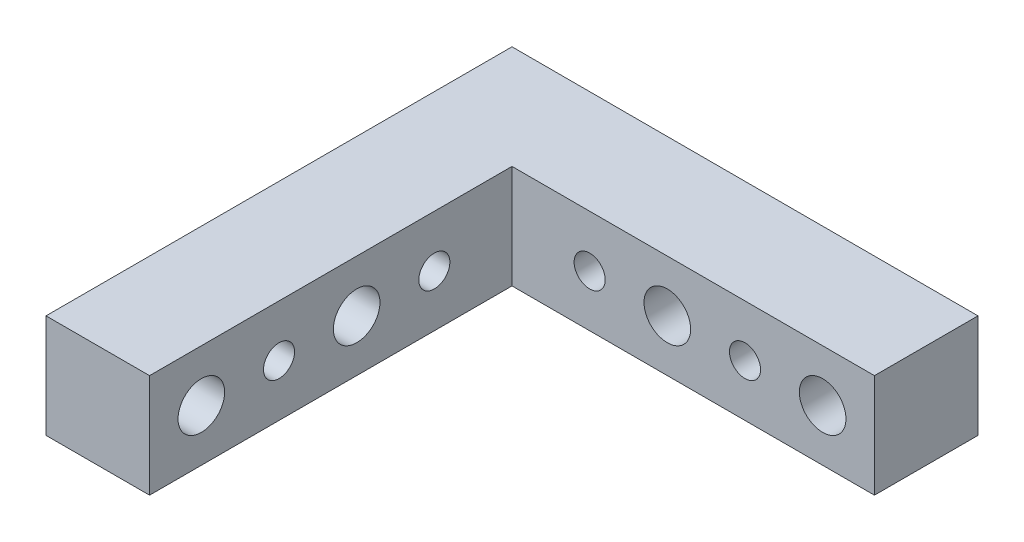
ISO-10303-21;
HEADER;
FILE_DESCRIPTION(('STEP AP214'),'2;1');
FILE_NAME('part.step','',(''),(''),'','','');
FILE_SCHEMA(('AUTOMOTIVE_DESIGN { 1 0 10303 214 1 1 1 1 }'));
ENDSEC;
DATA;
#1=APPLICATION_CONTEXT('core data for automotive mechanical design processes');
#2=APPLICATION_PROTOCOL_DEFINITION('international standard','automotive_design',2000,#1);
#3=PRODUCT_CONTEXT('',#1,'mechanical');
#4=PRODUCT('Part','Part','',(#3));
#5=PRODUCT_RELATED_PRODUCT_CATEGORY('part','',(#4));
#6=PRODUCT_DEFINITION_FORMATION('','',#4);
#7=PRODUCT_DEFINITION_CONTEXT('part definition',#1,'design');
#8=PRODUCT_DEFINITION('design','',#6,#7);
#9=PRODUCT_DEFINITION_SHAPE('','',#8);
#10=(LENGTH_UNIT() NAMED_UNIT(*) SI_UNIT(.MILLI.,.METRE.));
#11=(NAMED_UNIT(*) PLANE_ANGLE_UNIT() SI_UNIT($,.RADIAN.));
#12=(NAMED_UNIT(*) SI_UNIT($,.STERADIAN.) SOLID_ANGLE_UNIT());
#13=UNCERTAINTY_MEASURE_WITH_UNIT(LENGTH_MEASURE(1.E-05),#10,'distance_accuracy_value','');
#14=(GEOMETRIC_REPRESENTATION_CONTEXT(3) GLOBAL_UNCERTAINTY_ASSIGNED_CONTEXT((#13)) GLOBAL_UNIT_ASSIGNED_CONTEXT((#10,
#11,#12)) REPRESENTATION_CONTEXT('',''));
#15=CARTESIAN_POINT('',(0.,0.,0.));
#16=DIRECTION('',(0.,0.,1.));
#17=DIRECTION('',(1.,0.,0.));
#18=AXIS2_PLACEMENT_3D('',#15,#16,#17);
#19=CARTESIAN_POINT('',(90.,20.,0.));
#20=DIRECTION('',(0.,0.,1.));
#21=DIRECTION('',(1.,0.,0.));
#22=AXIS2_PLACEMENT_3D('',#19,#20,#21);
#23=PLANE('',#22);
#24=CARTESIAN_POINT('',(35.,10.,0.));
#25=DIRECTION('',(0.,0.,-1.));
#26=DIRECTION('',(-1.,0.,0.));
#27=AXIS2_PLACEMENT_3D('',#24,#25,#26);
#28=CIRCLE('',#27,3.);
#29=CARTESIAN_POINT('',(32.,10.,0.));
#30=VERTEX_POINT('',#29);
#31=EDGE_CURVE('E164',#30,#30,#28,.T.);
#32=ORIENTED_EDGE('',*,*,#31,.F.);
#33=EDGE_LOOP('',(#32));
#34=FACE_BOUND('',#33,.T.);
#35=CARTESIAN_POINT('',(50.,10.,0.));
#36=DIRECTION('',(0.,0.,-1.));
#37=DIRECTION('',(-1.,0.,0.));
#38=AXIS2_PLACEMENT_3D('',#35,#36,#37);
#39=CIRCLE('',#38,4.5);
#40=CARTESIAN_POINT('',(45.5,10.,0.));
#41=VERTEX_POINT('',#40);
#42=EDGE_CURVE('E168',#41,#41,#39,.T.);
#43=ORIENTED_EDGE('',*,*,#42,.F.);
#44=EDGE_LOOP('',(#43));
#45=FACE_BOUND('',#44,.T.);
#46=CARTESIAN_POINT('',(65.,10.,0.));
#47=DIRECTION('',(0.,0.,-1.));
#48=DIRECTION('',(-1.,0.,0.));
#49=AXIS2_PLACEMENT_3D('',#46,#47,#48);
#50=CIRCLE('',#49,3.);
#51=CARTESIAN_POINT('',(62.,10.,0.));
#52=VERTEX_POINT('',#51);
#53=EDGE_CURVE('E172',#52,#52,#50,.T.);
#54=ORIENTED_EDGE('',*,*,#53,.F.);
#55=EDGE_LOOP('',(#54));
#56=FACE_BOUND('',#55,.T.);
#57=CARTESIAN_POINT('',(80.,10.,0.));
#58=DIRECTION('',(0.,0.,-1.));
#59=DIRECTION('',(-1.,0.,0.));
#60=AXIS2_PLACEMENT_3D('',#57,#58,#59);
#61=CIRCLE('',#60,4.5);
#62=CARTESIAN_POINT('',(75.5,10.,0.));
#63=VERTEX_POINT('',#62);
#64=EDGE_CURVE('E175',#63,#63,#61,.T.);
#65=ORIENTED_EDGE('',*,*,#64,.F.);
#66=EDGE_LOOP('',(#65));
#67=FACE_BOUND('',#66,.T.);
#68=DIRECTION('',(-1.,0.,0.));
#69=VECTOR('',#68,1.);
#70=CARTESIAN_POINT('',(90.,0.,0.));
#71=LINE('',#70,#69);
#72=CARTESIAN_POINT('',(90.,0.,0.));
#73=VERTEX_POINT('',#72);
#74=CARTESIAN_POINT('',(0.,0.,0.));
#75=VERTEX_POINT('',#74);
#76=EDGE_CURVE('E119',#73,#75,#71,.T.);
#77=ORIENTED_EDGE('',*,*,#76,.T.);
#78=DIRECTION('',(0.,-1.,0.));
#79=VECTOR('',#78,1.);
#80=CARTESIAN_POINT('',(0.,20.,0.));
#81=LINE('',#80,#79);
#82=CARTESIAN_POINT('',(0.,20.,0.));
#83=VERTEX_POINT('',#82);
#84=EDGE_CURVE('E11',#83,#75,#81,.T.);
#85=ORIENTED_EDGE('',*,*,#84,.F.);
#86=DIRECTION('',(-1.,0.,0.));
#87=VECTOR('',#86,1.);
#88=CARTESIAN_POINT('',(90.,20.,0.));
#89=LINE('',#88,#87);
#90=CARTESIAN_POINT('',(90.,20.,0.));
#91=VERTEX_POINT('',#90);
#92=EDGE_CURVE('E130',#91,#83,#89,.T.);
#93=ORIENTED_EDGE('',*,*,#92,.F.);
#94=DIRECTION('',(0.,-1.,0.));
#95=VECTOR('',#94,1.);
#96=CARTESIAN_POINT('',(90.,20.,0.));
#97=LINE('',#96,#95);
#98=EDGE_CURVE('E115',#91,#73,#97,.T.);
#99=ORIENTED_EDGE('',*,*,#98,.T.);
#100=EDGE_LOOP('',(#77,#85,#93,#99));
#101=FACE_BOUND('',#100,.T.);
#102=ADVANCED_FACE('F35',(#34,#45,#56,#67,#101),#23,.F.);
#103=CARTESIAN_POINT('',(0.,20.,0.));
#104=DIRECTION('',(1.,0.,0.));
#105=DIRECTION('',(0.,0.,-1.));
#106=AXIS2_PLACEMENT_3D('',#103,#104,#105);
#107=PLANE('',#106);
#108=CARTESIAN_POINT('',(0.,10.,35.));
#109=DIRECTION('',(-1.,0.,0.));
#110=DIRECTION('',(0.,0.,1.));
#111=AXIS2_PLACEMENT_3D('',#108,#109,#110);
#112=CIRCLE('',#111,2.99999999999999);
#113=CARTESIAN_POINT('',(0.,10.,38.));
#114=VERTEX_POINT('',#113);
#115=EDGE_CURVE('E185',#114,#114,#112,.T.);
#116=ORIENTED_EDGE('',*,*,#115,.F.);
#117=EDGE_LOOP('',(#116));
#118=FACE_BOUND('',#117,.T.);
#119=CARTESIAN_POINT('',(0.,10.,50.));
#120=DIRECTION('',(-1.,0.,0.));
#121=DIRECTION('',(0.,0.,1.));
#122=AXIS2_PLACEMENT_3D('',#119,#120,#121);
#123=CIRCLE('',#122,4.5);
#124=CARTESIAN_POINT('',(0.,10.,54.5));
#125=VERTEX_POINT('',#124);
#126=EDGE_CURVE('E191',#125,#125,#123,.T.);
#127=ORIENTED_EDGE('',*,*,#126,.F.);
#128=EDGE_LOOP('',(#127));
#129=FACE_BOUND('',#128,.T.);
#130=CARTESIAN_POINT('',(0.,10.,65.));
#131=DIRECTION('',(-1.,0.,0.));
#132=DIRECTION('',(0.,0.,1.));
#133=AXIS2_PLACEMENT_3D('',#130,#131,#132);
#134=CIRCLE('',#133,3.00000000000001);
#135=CARTESIAN_POINT('',(0.,10.,68.));
#136=VERTEX_POINT('',#135);
#137=EDGE_CURVE('E197',#136,#136,#134,.T.);
#138=ORIENTED_EDGE('',*,*,#137,.F.);
#139=EDGE_LOOP('',(#138));
#140=FACE_BOUND('',#139,.T.);
#141=CARTESIAN_POINT('',(0.,10.,80.));
#142=DIRECTION('',(-1.,0.,0.));
#143=DIRECTION('',(0.,0.,1.));
#144=AXIS2_PLACEMENT_3D('',#141,#142,#143);
#145=CIRCLE('',#144,4.5);
#146=CARTESIAN_POINT('',(0.,10.,84.5));
#147=VERTEX_POINT('',#146);
#148=EDGE_CURVE('E203',#147,#147,#145,.T.);
#149=ORIENTED_EDGE('',*,*,#148,.F.);
#150=EDGE_LOOP('',(#149));
#151=FACE_BOUND('',#150,.T.);
#152=DIRECTION('',(0.,0.,1.));
#153=VECTOR('',#152,1.);
#154=CARTESIAN_POINT('',(0.,0.,0.));
#155=LINE('',#154,#153);
#156=CARTESIAN_POINT('',(0.,0.,90.));
#157=VERTEX_POINT('',#156);
#158=EDGE_CURVE('E122',#75,#157,#155,.T.);
#159=ORIENTED_EDGE('',*,*,#158,.T.);
#160=DIRECTION('',(0.,-1.,0.));
#161=VECTOR('',#160,1.);
#162=CARTESIAN_POINT('',(0.,20.,90.));
#163=LINE('',#162,#161);
#164=CARTESIAN_POINT('',(0.,20.,90.));
#165=VERTEX_POINT('',#164);
#166=EDGE_CURVE('E43',#165,#157,#163,.T.);
#167=ORIENTED_EDGE('',*,*,#166,.F.);
#168=DIRECTION('',(0.,0.,1.));
#169=VECTOR('',#168,1.);
#170=CARTESIAN_POINT('',(0.,20.,0.));
#171=LINE('',#170,#169);
#172=EDGE_CURVE('E88',#83,#165,#171,.T.);
#173=ORIENTED_EDGE('',*,*,#172,.F.);
#174=ORIENTED_EDGE('',*,*,#84,.T.);
#175=EDGE_LOOP('',(#159,#167,#173,#174));
#176=FACE_BOUND('',#175,.T.);
#177=ADVANCED_FACE('F155',(#118,#129,#140,#151,#176),#107,.F.);
#178=CARTESIAN_POINT('',(0.,20.,90.));
#179=DIRECTION('',(0.,0.,-1.));
#180=DIRECTION('',(-1.,0.,0.));
#181=AXIS2_PLACEMENT_3D('',#178,#179,#180);
#182=PLANE('',#181);
#183=DIRECTION('',(1.,0.,0.));
#184=VECTOR('',#183,1.);
#185=CARTESIAN_POINT('',(0.,0.,90.));
#186=LINE('',#185,#184);
#187=CARTESIAN_POINT('',(20.,0.,90.));
#188=VERTEX_POINT('',#187);
#189=EDGE_CURVE('E125',#157,#188,#186,.T.);
#190=ORIENTED_EDGE('',*,*,#189,.T.);
#191=DIRECTION('',(0.,-1.,0.));
#192=VECTOR('',#191,1.);
#193=CARTESIAN_POINT('',(20.,20.,90.));
#194=LINE('',#193,#192);
#195=CARTESIAN_POINT('',(20.,20.,90.));
#196=VERTEX_POINT('',#195);
#197=EDGE_CURVE('E110',#196,#188,#194,.T.);
#198=ORIENTED_EDGE('',*,*,#197,.F.);
#199=DIRECTION('',(1.,0.,0.));
#200=VECTOR('',#199,1.);
#201=CARTESIAN_POINT('',(0.,20.,90.));
#202=LINE('',#201,#200);
#203=EDGE_CURVE('E101',#165,#196,#202,.T.);
#204=ORIENTED_EDGE('',*,*,#203,.F.);
#205=ORIENTED_EDGE('',*,*,#166,.T.);
#206=EDGE_LOOP('',(#190,#198,#204,#205));
#207=FACE_BOUND('',#206,.T.);
#208=ADVANCED_FACE('F136',(#207),#182,.F.);
#209=CARTESIAN_POINT('',(20.,20.,90.));
#210=DIRECTION('',(-1.,0.,0.));
#211=DIRECTION('',(0.,0.,1.));
#212=AXIS2_PLACEMENT_3D('',#209,#210,#211);
#213=PLANE('',#212);
#214=CARTESIAN_POINT('',(20.,10.,35.));
#215=DIRECTION('',(-1.,0.,0.));
#216=DIRECTION('',(0.,0.,1.));
#217=AXIS2_PLACEMENT_3D('',#214,#215,#216);
#218=CIRCLE('',#217,2.99999999999999);
#219=CARTESIAN_POINT('',(20.,10.,38.));
#220=VERTEX_POINT('',#219);
#221=EDGE_CURVE('E123',#220,#220,#218,.T.);
#222=ORIENTED_EDGE('',*,*,#221,.T.);
#223=EDGE_LOOP('',(#222));
#224=FACE_BOUND('',#223,.T.);
#225=CARTESIAN_POINT('',(20.,10.,50.));
#226=DIRECTION('',(-1.,0.,0.));
#227=DIRECTION('',(0.,0.,1.));
#228=AXIS2_PLACEMENT_3D('',#225,#226,#227);
#229=CIRCLE('',#228,4.5);
#230=CARTESIAN_POINT('',(20.,10.,54.5));
#231=VERTEX_POINT('',#230);
#232=EDGE_CURVE('E188',#231,#231,#229,.T.);
#233=ORIENTED_EDGE('',*,*,#232,.T.);
#234=EDGE_LOOP('',(#233));
#235=FACE_BOUND('',#234,.T.);
#236=CARTESIAN_POINT('',(20.,10.,65.));
#237=DIRECTION('',(-1.,0.,0.));
#238=DIRECTION('',(0.,0.,1.));
#239=AXIS2_PLACEMENT_3D('',#236,#237,#238);
#240=CIRCLE('',#239,3.00000000000001);
#241=CARTESIAN_POINT('',(20.,10.,68.));
#242=VERTEX_POINT('',#241);
#243=EDGE_CURVE('E194',#242,#242,#240,.T.);
#244=ORIENTED_EDGE('',*,*,#243,.T.);
#245=EDGE_LOOP('',(#244));
#246=FACE_BOUND('',#245,.T.);
#247=CARTESIAN_POINT('',(20.,10.,80.));
#248=DIRECTION('',(-1.,0.,0.));
#249=DIRECTION('',(0.,0.,1.));
#250=AXIS2_PLACEMENT_3D('',#247,#248,#249);
#251=CIRCLE('',#250,4.5);
#252=CARTESIAN_POINT('',(20.,10.,84.5));
#253=VERTEX_POINT('',#252);
#254=EDGE_CURVE('E200',#253,#253,#251,.T.);
#255=ORIENTED_EDGE('',*,*,#254,.T.);
#256=EDGE_LOOP('',(#255));
#257=FACE_BOUND('',#256,.T.);
#258=DIRECTION('',(0.,0.,-1.));
#259=VECTOR('',#258,1.);
#260=CARTESIAN_POINT('',(20.,0.,90.));
#261=LINE('',#260,#259);
#262=CARTESIAN_POINT('',(20.,0.,20.));
#263=VERTEX_POINT('',#262);
#264=EDGE_CURVE('E109',#188,#263,#261,.T.);
#265=ORIENTED_EDGE('',*,*,#264,.T.);
#266=DIRECTION('',(0.,-1.,0.));
#267=VECTOR('',#266,1.);
#268=CARTESIAN_POINT('',(20.,20.,20.));
#269=LINE('',#268,#267);
#270=CARTESIAN_POINT('',(20.,20.,20.));
#271=VERTEX_POINT('',#270);
#272=EDGE_CURVE('E106',#271,#263,#269,.T.);
#273=ORIENTED_EDGE('',*,*,#272,.F.);
#274=DIRECTION('',(0.,0.,-1.));
#275=VECTOR('',#274,1.);
#276=CARTESIAN_POINT('',(20.,20.,90.));
#277=LINE('',#276,#275);
#278=EDGE_CURVE('E95',#196,#271,#277,.T.);
#279=ORIENTED_EDGE('',*,*,#278,.F.);
#280=ORIENTED_EDGE('',*,*,#197,.T.);
#281=EDGE_LOOP('',(#265,#273,#279,#280));
#282=FACE_BOUND('',#281,.T.);
#283=ADVANCED_FACE('F107',(#224,#235,#246,#257,#282),#213,.F.);
#284=CARTESIAN_POINT('',(20.,20.,20.));
#285=DIRECTION('',(0.,0.,-1.));
#286=DIRECTION('',(-1.,0.,0.));
#287=AXIS2_PLACEMENT_3D('',#284,#285,#286);
#288=PLANE('',#287);
#289=CARTESIAN_POINT('',(35.,10.,20.));
#290=DIRECTION('',(0.,0.,-1.));
#291=DIRECTION('',(-1.,0.,0.));
#292=AXIS2_PLACEMENT_3D('',#289,#290,#291);
#293=CIRCLE('',#292,3.);
#294=CARTESIAN_POINT('',(32.,10.,20.));
#295=VERTEX_POINT('',#294);
#296=EDGE_CURVE('E206',#295,#295,#293,.T.);
#297=ORIENTED_EDGE('',*,*,#296,.T.);
#298=EDGE_LOOP('',(#297));
#299=FACE_BOUND('',#298,.T.);
#300=CARTESIAN_POINT('',(50.,10.,20.));
#301=DIRECTION('',(0.,0.,-1.));
#302=DIRECTION('',(-1.,0.,0.));
#303=AXIS2_PLACEMENT_3D('',#300,#301,#302);
#304=CIRCLE('',#303,4.5);
#305=CARTESIAN_POINT('',(45.5,10.,20.));
#306=VERTEX_POINT('',#305);
#307=EDGE_CURVE('E213',#306,#306,#304,.T.);
#308=ORIENTED_EDGE('',*,*,#307,.T.);
#309=EDGE_LOOP('',(#308));
#310=FACE_BOUND('',#309,.T.);
#311=CARTESIAN_POINT('',(65.,10.,20.));
#312=DIRECTION('',(0.,0.,-1.));
#313=DIRECTION('',(-1.,0.,0.));
#314=AXIS2_PLACEMENT_3D('',#311,#312,#313);
#315=CIRCLE('',#314,3.);
#316=CARTESIAN_POINT('',(62.,10.,20.));
#317=VERTEX_POINT('',#316);
#318=EDGE_CURVE('E219',#317,#317,#315,.T.);
#319=ORIENTED_EDGE('',*,*,#318,.T.);
#320=EDGE_LOOP('',(#319));
#321=FACE_BOUND('',#320,.T.);
#322=CARTESIAN_POINT('',(80.,10.,20.));
#323=DIRECTION('',(0.,0.,-1.));
#324=DIRECTION('',(-1.,0.,0.));
#325=AXIS2_PLACEMENT_3D('',#322,#323,#324);
#326=CIRCLE('',#325,4.5);
#327=CARTESIAN_POINT('',(75.5,10.,20.));
#328=VERTEX_POINT('',#327);
#329=EDGE_CURVE('E177',#328,#328,#326,.T.);
#330=ORIENTED_EDGE('',*,*,#329,.T.);
#331=EDGE_LOOP('',(#330));
#332=FACE_BOUND('',#331,.T.);
#333=DIRECTION('',(1.,0.,0.));
#334=VECTOR('',#333,1.);
#335=CARTESIAN_POINT('',(20.,0.,20.));
#336=LINE('',#335,#334);
#337=CARTESIAN_POINT('',(90.,0.,20.));
#338=VERTEX_POINT('',#337);
#339=EDGE_CURVE('E74',#263,#338,#336,.T.);
#340=ORIENTED_EDGE('',*,*,#339,.T.);
#341=DIRECTION('',(0.,-1.,0.));
#342=VECTOR('',#341,1.);
#343=CARTESIAN_POINT('',(90.,20.,20.));
#344=LINE('',#343,#342);
#345=CARTESIAN_POINT('',(90.,20.,20.));
#346=VERTEX_POINT('',#345);
#347=EDGE_CURVE('E111',#346,#338,#344,.T.);
#348=ORIENTED_EDGE('',*,*,#347,.F.);
#349=DIRECTION('',(1.,0.,0.));
#350=VECTOR('',#349,1.);
#351=CARTESIAN_POINT('',(20.,20.,20.));
#352=LINE('',#351,#350);
#353=EDGE_CURVE('E99',#271,#346,#352,.T.);
#354=ORIENTED_EDGE('',*,*,#353,.F.);
#355=ORIENTED_EDGE('',*,*,#272,.T.);
#356=EDGE_LOOP('',(#340,#348,#354,#355));
#357=FACE_BOUND('',#356,.T.);
#358=ADVANCED_FACE('F113',(#299,#310,#321,#332,#357),#288,.F.);
#359=CARTESIAN_POINT('',(90.,20.,20.));
#360=DIRECTION('',(-1.,0.,0.));
#361=DIRECTION('',(0.,0.,1.));
#362=AXIS2_PLACEMENT_3D('',#359,#360,#361);
#363=PLANE('',#362);
#364=DIRECTION('',(0.,0.,-1.));
#365=VECTOR('',#364,1.);
#366=CARTESIAN_POINT('',(90.,0.,20.));
#367=LINE('',#366,#365);
#368=EDGE_CURVE('E80',#338,#73,#367,.T.);
#369=ORIENTED_EDGE('',*,*,#368,.T.);
#370=ORIENTED_EDGE('',*,*,#98,.F.);
#371=DIRECTION('',(0.,0.,-1.));
#372=VECTOR('',#371,1.);
#373=CARTESIAN_POINT('',(90.,20.,20.));
#374=LINE('',#373,#372);
#375=EDGE_CURVE('E51',#346,#91,#374,.T.);
#376=ORIENTED_EDGE('',*,*,#375,.F.);
#377=ORIENTED_EDGE('',*,*,#347,.T.);
#378=EDGE_LOOP('',(#369,#370,#376,#377));
#379=FACE_BOUND('',#378,.T.);
#380=ADVANCED_FACE('F143',(#379),#363,.F.);
#381=CARTESIAN_POINT('',(0.,20.,0.));
#382=DIRECTION('',(0.,1.,0.));
#383=DIRECTION('',(0.,0.,1.));
#384=AXIS2_PLACEMENT_3D('',#381,#382,#383);
#385=PLANE('',#384);
#386=ORIENTED_EDGE('',*,*,#92,.T.);
#387=ORIENTED_EDGE('',*,*,#172,.T.);
#388=ORIENTED_EDGE('',*,*,#203,.T.);
#389=ORIENTED_EDGE('',*,*,#278,.T.);
#390=ORIENTED_EDGE('',*,*,#353,.T.);
#391=ORIENTED_EDGE('',*,*,#375,.T.);
#392=EDGE_LOOP('',(#386,#387,#388,#389,#390,#391));
#393=FACE_BOUND('',#392,.T.);
#394=ADVANCED_FACE('F97',(#393),#385,.T.);
#395=CARTESIAN_POINT('',(0.,0.,0.));
#396=DIRECTION('',(0.,1.,0.));
#397=DIRECTION('',(0.,0.,1.));
#398=AXIS2_PLACEMENT_3D('',#395,#396,#397);
#399=PLANE('',#398);
#400=ORIENTED_EDGE('',*,*,#76,.F.);
#401=ORIENTED_EDGE('',*,*,#368,.F.);
#402=ORIENTED_EDGE('',*,*,#339,.F.);
#403=ORIENTED_EDGE('',*,*,#264,.F.);
#404=ORIENTED_EDGE('',*,*,#189,.F.);
#405=ORIENTED_EDGE('',*,*,#158,.F.);
#406=EDGE_LOOP('',(#400,#401,#402,#403,#404,#405));
#407=FACE_BOUND('',#406,.T.);
#408=ADVANCED_FACE('F139',(#407),#399,.F.);
#409=CARTESIAN_POINT('',(20.,10.,80.));
#410=DIRECTION('',(-1.,0.,0.));
#411=DIRECTION('',(0.,0.,1.));
#412=AXIS2_PLACEMENT_3D('',#409,#410,#411);
#413=CYLINDRICAL_SURFACE('',#412,4.5);
#414=ORIENTED_EDGE('',*,*,#254,.F.);
#415=EDGE_LOOP('',(#414));
#416=FACE_BOUND('',#415,.T.);
#417=ORIENTED_EDGE('',*,*,#148,.T.);
#418=EDGE_LOOP('',(#417));
#419=FACE_BOUND('',#418,.T.);
#420=ADVANCED_FACE('F251',(#416,#419),#413,.F.);
#421=CARTESIAN_POINT('',(20.,10.,65.));
#422=DIRECTION('',(-1.,0.,0.));
#423=DIRECTION('',(0.,0.,1.));
#424=AXIS2_PLACEMENT_3D('',#421,#422,#423);
#425=CYLINDRICAL_SURFACE('',#424,3.00000000000001);
#426=ORIENTED_EDGE('',*,*,#243,.F.);
#427=EDGE_LOOP('',(#426));
#428=FACE_BOUND('',#427,.T.);
#429=ORIENTED_EDGE('',*,*,#137,.T.);
#430=EDGE_LOOP('',(#429));
#431=FACE_BOUND('',#430,.T.);
#432=ADVANCED_FACE('F247',(#428,#431),#425,.F.);
#433=CARTESIAN_POINT('',(20.,10.,50.));
#434=DIRECTION('',(-1.,0.,0.));
#435=DIRECTION('',(0.,0.,1.));
#436=AXIS2_PLACEMENT_3D('',#433,#434,#435);
#437=CYLINDRICAL_SURFACE('',#436,4.5);
#438=ORIENTED_EDGE('',*,*,#232,.F.);
#439=EDGE_LOOP('',(#438));
#440=FACE_BOUND('',#439,.T.);
#441=ORIENTED_EDGE('',*,*,#126,.T.);
#442=EDGE_LOOP('',(#441));
#443=FACE_BOUND('',#442,.T.);
#444=ADVANCED_FACE('F243',(#440,#443),#437,.F.);
#445=CARTESIAN_POINT('',(20.,10.,35.));
#446=DIRECTION('',(-1.,0.,0.));
#447=DIRECTION('',(0.,0.,1.));
#448=AXIS2_PLACEMENT_3D('',#445,#446,#447);
#449=CYLINDRICAL_SURFACE('',#448,2.99999999999999);
#450=ORIENTED_EDGE('',*,*,#221,.F.);
#451=EDGE_LOOP('',(#450));
#452=FACE_BOUND('',#451,.T.);
#453=ORIENTED_EDGE('',*,*,#115,.T.);
#454=EDGE_LOOP('',(#453));
#455=FACE_BOUND('',#454,.T.);
#456=ADVANCED_FACE('F235',(#452,#455),#449,.F.);
#457=CARTESIAN_POINT('',(80.,10.,20.));
#458=DIRECTION('',(0.,0.,-1.));
#459=DIRECTION('',(-1.,0.,0.));
#460=AXIS2_PLACEMENT_3D('',#457,#458,#459);
#461=CYLINDRICAL_SURFACE('',#460,4.5);
#462=ORIENTED_EDGE('',*,*,#329,.F.);
#463=EDGE_LOOP('',(#462));
#464=FACE_BOUND('',#463,.T.);
#465=ORIENTED_EDGE('',*,*,#64,.T.);
#466=EDGE_LOOP('',(#465));
#467=FACE_BOUND('',#466,.T.);
#468=ADVANCED_FACE('F225',(#464,#467),#461,.F.);
#469=CARTESIAN_POINT('',(65.,10.,20.));
#470=DIRECTION('',(0.,0.,-1.));
#471=DIRECTION('',(-1.,0.,0.));
#472=AXIS2_PLACEMENT_3D('',#469,#470,#471);
#473=CYLINDRICAL_SURFACE('',#472,3.);
#474=ORIENTED_EDGE('',*,*,#318,.F.);
#475=EDGE_LOOP('',(#474));
#476=FACE_BOUND('',#475,.T.);
#477=ORIENTED_EDGE('',*,*,#53,.T.);
#478=EDGE_LOOP('',(#477));
#479=FACE_BOUND('',#478,.T.);
#480=ADVANCED_FACE('F222',(#476,#479),#473,.F.);
#481=CARTESIAN_POINT('',(50.,10.,20.));
#482=DIRECTION('',(0.,0.,-1.));
#483=DIRECTION('',(-1.,0.,0.));
#484=AXIS2_PLACEMENT_3D('',#481,#482,#483);
#485=CYLINDRICAL_SURFACE('',#484,4.5);
#486=ORIENTED_EDGE('',*,*,#307,.F.);
#487=EDGE_LOOP('',(#486));
#488=FACE_BOUND('',#487,.T.);
#489=ORIENTED_EDGE('',*,*,#42,.T.);
#490=EDGE_LOOP('',(#489));
#491=FACE_BOUND('',#490,.T.);
#492=ADVANCED_FACE('F224',(#488,#491),#485,.F.);
#493=CARTESIAN_POINT('',(35.,10.,20.));
#494=DIRECTION('',(0.,0.,-1.));
#495=DIRECTION('',(-1.,0.,0.));
#496=AXIS2_PLACEMENT_3D('',#493,#494,#495);
#497=CYLINDRICAL_SURFACE('',#496,3.);
#498=ORIENTED_EDGE('',*,*,#296,.F.);
#499=EDGE_LOOP('',(#498));
#500=FACE_BOUND('',#499,.T.);
#501=ORIENTED_EDGE('',*,*,#31,.T.);
#502=EDGE_LOOP('',(#501));
#503=FACE_BOUND('',#502,.T.);
#504=ADVANCED_FACE('F232',(#500,#503),#497,.F.);
#505=CLOSED_SHELL('',(#102,#177,#208,#283,#358,#380,#394,#408,#420,#432,#444,#456,#468,#480,
#492,#504));
#506=MANIFOLD_SOLID_BREP('B2',#505);
#507=ADVANCED_BREP_SHAPE_REPRESENTATION('',(#18,#506),#14);
#508=SHAPE_DEFINITION_REPRESENTATION(#9,#507);
ENDSEC;
END-ISO-10303-21;
